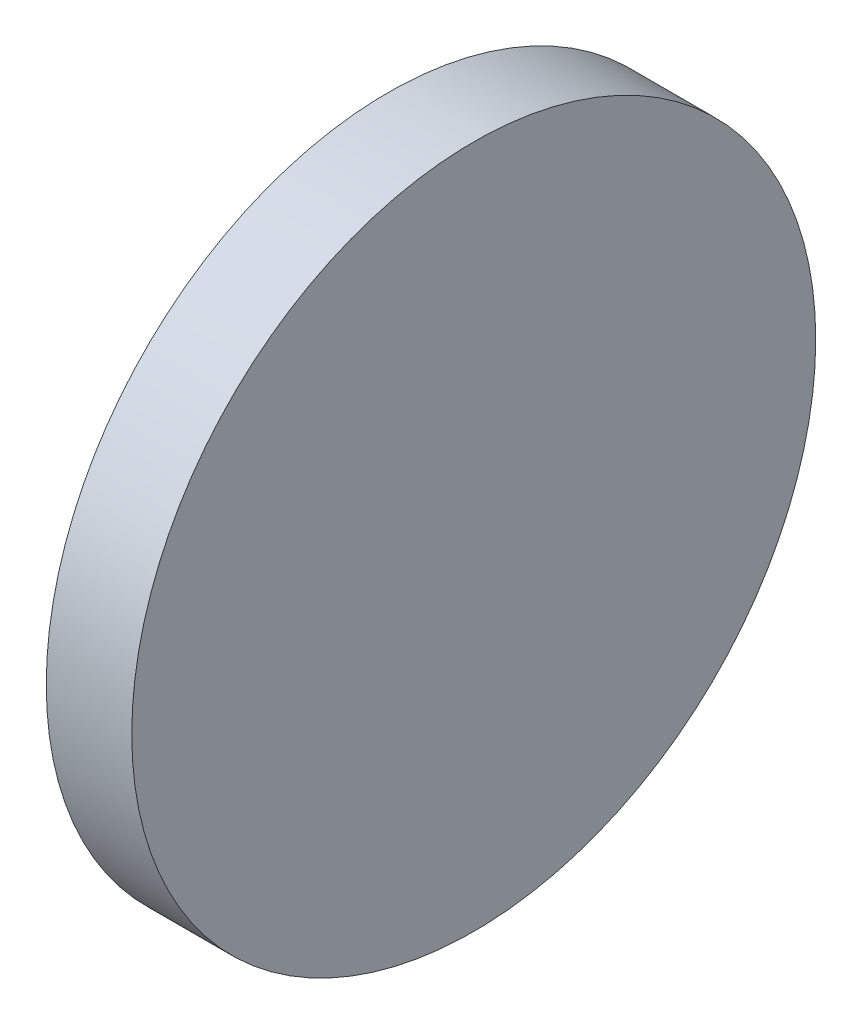
ISO-10303-21;
HEADER;
FILE_DESCRIPTION(('STEP AP214'),'2;1');
FILE_NAME('part.step','',(''),(''),'','','');
FILE_SCHEMA(('AUTOMOTIVE_DESIGN { 1 0 10303 214 1 1 1 1 }'));
ENDSEC;
DATA;
#1=APPLICATION_CONTEXT('core data for automotive mechanical design processes');
#2=APPLICATION_PROTOCOL_DEFINITION('international standard','automotive_design',2000,#1);
#3=PRODUCT_CONTEXT('',#1,'mechanical');
#4=PRODUCT('Part','Part','',(#3));
#5=PRODUCT_RELATED_PRODUCT_CATEGORY('part','',(#4));
#6=PRODUCT_DEFINITION_FORMATION('','',#4);
#7=PRODUCT_DEFINITION_CONTEXT('part definition',#1,'design');
#8=PRODUCT_DEFINITION('design','',#6,#7);
#9=PRODUCT_DEFINITION_SHAPE('','',#8);
#10=(LENGTH_UNIT() NAMED_UNIT(*) SI_UNIT(.MILLI.,.METRE.));
#11=(NAMED_UNIT(*) PLANE_ANGLE_UNIT() SI_UNIT($,.RADIAN.));
#12=(NAMED_UNIT(*) SI_UNIT($,.STERADIAN.) SOLID_ANGLE_UNIT());
#13=UNCERTAINTY_MEASURE_WITH_UNIT(LENGTH_MEASURE(1.E-05),#10,'distance_accuracy_value','');
#14=(GEOMETRIC_REPRESENTATION_CONTEXT(3) GLOBAL_UNCERTAINTY_ASSIGNED_CONTEXT((#13)) GLOBAL_UNIT_ASSIGNED_CONTEXT((#10,
#11,#12)) REPRESENTATION_CONTEXT('',''));
#15=CARTESIAN_POINT('',(0.,0.,0.));
#16=DIRECTION('',(0.,0.,1.));
#17=DIRECTION('',(1.,0.,0.));
#18=AXIS2_PLACEMENT_3D('',#15,#16,#17);
#19=CARTESIAN_POINT('',(6.35,0.,0.));
#20=DIRECTION('',(-1.,0.,0.));
#21=DIRECTION('',(0.,0.,1.));
#22=AXIS2_PLACEMENT_3D('',#19,#20,#21);
#23=CYLINDRICAL_SURFACE('',#22,25.4);
#24=CARTESIAN_POINT('',(6.35,0.,0.));
#25=DIRECTION('',(1.,0.,0.));
#26=DIRECTION('',(0.,0.,-1.));
#27=AXIS2_PLACEMENT_3D('',#24,#25,#26);
#28=CIRCLE('',#27,25.4);
#29=CARTESIAN_POINT('',(6.35,0.,-25.4));
#30=VERTEX_POINT('',#29);
#31=EDGE_CURVE('E10',#30,#30,#28,.T.);
#32=ORIENTED_EDGE('',*,*,#31,.F.);
#33=EDGE_LOOP('',(#32));
#34=FACE_BOUND('',#33,.T.);
#35=CARTESIAN_POINT('',(0.,0.,0.));
#36=DIRECTION('',(1.,0.,0.));
#37=DIRECTION('',(0.,0.,-1.));
#38=AXIS2_PLACEMENT_3D('',#35,#36,#37);
#39=CIRCLE('',#38,25.4);
#40=CARTESIAN_POINT('',(0.,0.,-25.4));
#41=VERTEX_POINT('',#40);
#42=EDGE_CURVE('E38',#41,#41,#39,.T.);
#43=ORIENTED_EDGE('',*,*,#42,.T.);
#44=EDGE_LOOP('',(#43));
#45=FACE_BOUND('',#44,.T.);
#46=ADVANCED_FACE('F35',(#34,#45),#23,.T.);
#47=CARTESIAN_POINT('',(6.35,0.,0.));
#48=DIRECTION('',(1.,0.,0.));
#49=DIRECTION('',(0.,0.,-1.));
#50=AXIS2_PLACEMENT_3D('',#47,#48,#49);
#51=PLANE('',#50);
#52=ORIENTED_EDGE('',*,*,#31,.T.);
#53=EDGE_LOOP('',(#52));
#54=FACE_BOUND('',#53,.T.);
#55=ADVANCED_FACE('F50',(#54),#51,.T.);
#56=CARTESIAN_POINT('',(0.,0.,0.));
#57=DIRECTION('',(1.,0.,0.));
#58=DIRECTION('',(0.,0.,-1.));
#59=AXIS2_PLACEMENT_3D('',#56,#57,#58);
#60=PLANE('',#59);
#61=ORIENTED_EDGE('',*,*,#42,.F.);
#62=EDGE_LOOP('',(#61));
#63=FACE_BOUND('',#62,.T.);
#64=ADVANCED_FACE('F48',(#63),#60,.F.);
#65=CLOSED_SHELL('',(#46,#55,#64));
#66=MANIFOLD_SOLID_BREP('B2',#65);
#67=ADVANCED_BREP_SHAPE_REPRESENTATION('',(#18,#66),#14);
#68=SHAPE_DEFINITION_REPRESENTATION(#9,#67);
ENDSEC;
END-ISO-10303-21;
